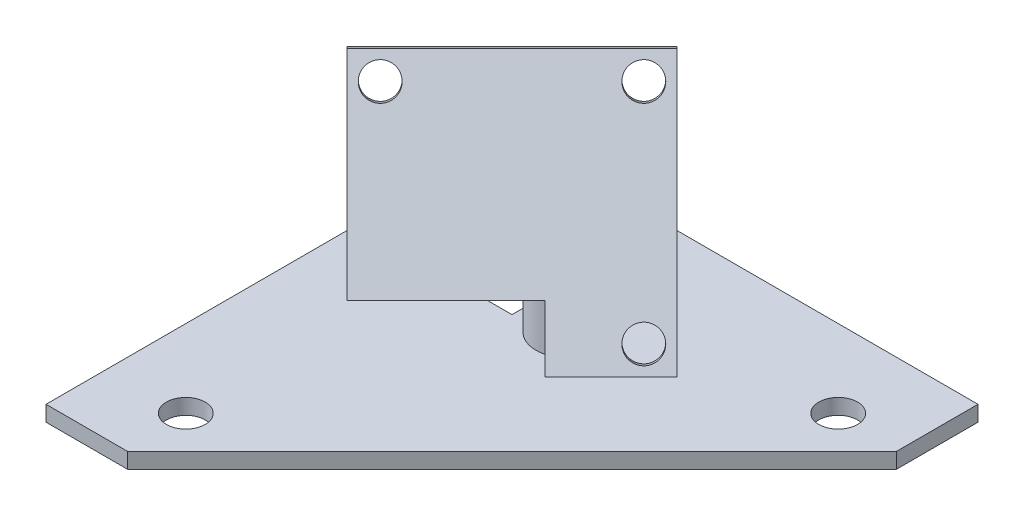
ISO-10303-21;
HEADER;
FILE_DESCRIPTION(('STEP AP214'),'2;1');
FILE_NAME('part.step','',(''),(''),'','','');
FILE_SCHEMA(('AUTOMOTIVE_DESIGN { 1 0 10303 214 1 1 1 1 }'));
ENDSEC;
DATA;
#1=APPLICATION_CONTEXT('core data for automotive mechanical design processes');
#2=APPLICATION_PROTOCOL_DEFINITION('international standard','automotive_design',2000,#1);
#3=PRODUCT_CONTEXT('',#1,'mechanical');
#4=PRODUCT('Part','Part','',(#3));
#5=PRODUCT_RELATED_PRODUCT_CATEGORY('part','',(#4));
#6=PRODUCT_DEFINITION_FORMATION('','',#4);
#7=PRODUCT_DEFINITION_CONTEXT('part definition',#1,'design');
#8=PRODUCT_DEFINITION('design','',#6,#7);
#9=PRODUCT_DEFINITION_SHAPE('','',#8);
#10=(LENGTH_UNIT() NAMED_UNIT(*) SI_UNIT(.MILLI.,.METRE.));
#11=(NAMED_UNIT(*) PLANE_ANGLE_UNIT() SI_UNIT($,.RADIAN.));
#12=(NAMED_UNIT(*) SI_UNIT($,.STERADIAN.) SOLID_ANGLE_UNIT());
#13=UNCERTAINTY_MEASURE_WITH_UNIT(LENGTH_MEASURE(1.E-05),#10,'distance_accuracy_value','');
#14=(GEOMETRIC_REPRESENTATION_CONTEXT(3) GLOBAL_UNCERTAINTY_ASSIGNED_CONTEXT((#13)) GLOBAL_UNIT_ASSIGNED_CONTEXT((#10,
#11,#12)) REPRESENTATION_CONTEXT('',''));
#15=CARTESIAN_POINT('',(0.,0.,0.));
#16=DIRECTION('',(0.,0.,1.));
#17=DIRECTION('',(1.,0.,0.));
#18=AXIS2_PLACEMENT_3D('',#15,#16,#17);
#19=CARTESIAN_POINT('',(0.,2.,0.));
#20=DIRECTION('',(0.,0.,-1.));
#21=DIRECTION('',(-1.,0.,0.));
#22=AXIS2_PLACEMENT_3D('',#19,#20,#21);
#23=PLANE('',#22);
#24=DIRECTION('',(1.,0.,0.));
#25=VECTOR('',#24,1.);
#26=CARTESIAN_POINT('',(0.,0.,0.));
#27=LINE('',#26,#25);
#28=CARTESIAN_POINT('',(20.,0.,0.));
#29=VERTEX_POINT('',#28);
#30=CARTESIAN_POINT('',(60.,0.,0.));
#31=VERTEX_POINT('',#30);
#32=EDGE_CURVE('E135',#29,#31,#27,.T.);
#33=ORIENTED_EDGE('',*,*,#32,.F.);
#34=DIRECTION('',(0.,-1.,0.));
#35=VECTOR('',#34,1.);
#36=CARTESIAN_POINT('',(20.,2.,0.));
#37=LINE('',#36,#35);
#38=CARTESIAN_POINT('',(20.,2.,0.));
#39=VERTEX_POINT('',#38);
#40=EDGE_CURVE('E11',#39,#29,#37,.T.);
#41=ORIENTED_EDGE('',*,*,#40,.F.);
#42=DIRECTION('',(1.,0.,0.));
#43=VECTOR('',#42,1.);
#44=CARTESIAN_POINT('',(0.,2.,0.));
#45=LINE('',#44,#43);
#46=CARTESIAN_POINT('',(60.,2.,0.));
#47=VERTEX_POINT('',#46);
#48=EDGE_CURVE('E173',#39,#47,#45,.T.);
#49=ORIENTED_EDGE('',*,*,#48,.T.);
#50=DIRECTION('',(0.,-1.,0.));
#51=VECTOR('',#50,1.);
#52=CARTESIAN_POINT('',(60.,2.,0.));
#53=LINE('',#52,#51);
#54=EDGE_CURVE('E52',#47,#31,#53,.T.);
#55=ORIENTED_EDGE('',*,*,#54,.T.);
#56=EDGE_LOOP('',(#33,#41,#49,#55));
#57=FACE_BOUND('',#56,.T.);
#58=ADVANCED_FACE('F35',(#57),#23,.T.);
#59=CARTESIAN_POINT('',(20.,2.,0.));
#60=DIRECTION('',(1.,0.,0.));
#61=DIRECTION('',(0.,0.,-1.));
#62=AXIS2_PLACEMENT_3D('',#59,#60,#61);
#63=PLANE('',#62);
#64=DIRECTION('',(0.,0.,1.));
#65=VECTOR('',#64,1.);
#66=CARTESIAN_POINT('',(20.,0.,0.));
#67=LINE('',#66,#65);
#68=CARTESIAN_POINT('',(20.,0.,20.));
#69=VERTEX_POINT('',#68);
#70=EDGE_CURVE('E137',#29,#69,#67,.T.);
#71=ORIENTED_EDGE('',*,*,#70,.T.);
#72=DIRECTION('',(0.,-1.,0.));
#73=VECTOR('',#72,1.);
#74=CARTESIAN_POINT('',(20.,2.,20.));
#75=LINE('',#74,#73);
#76=CARTESIAN_POINT('',(20.,2.,20.));
#77=VERTEX_POINT('',#76);
#78=EDGE_CURVE('E44',#77,#69,#75,.T.);
#79=ORIENTED_EDGE('',*,*,#78,.F.);
#80=DIRECTION('',(0.,0.,1.));
#81=VECTOR('',#80,1.);
#82=CARTESIAN_POINT('',(20.,2.,0.));
#83=LINE('',#82,#81);
#84=EDGE_CURVE('E171',#39,#77,#83,.T.);
#85=ORIENTED_EDGE('',*,*,#84,.F.);
#86=ORIENTED_EDGE('',*,*,#40,.T.);
#87=EDGE_LOOP('',(#71,#79,#85,#86));
#88=FACE_BOUND('',#87,.T.);
#89=ADVANCED_FACE('F165',(#88),#63,.F.);
#90=CARTESIAN_POINT('',(0.,2.,20.));
#91=DIRECTION('',(0.,0.,-1.));
#92=DIRECTION('',(-1.,0.,0.));
#93=AXIS2_PLACEMENT_3D('',#90,#91,#92);
#94=PLANE('',#93);
#95=DIRECTION('',(1.,0.,0.));
#96=VECTOR('',#95,1.);
#97=CARTESIAN_POINT('',(0.,0.,20.));
#98=LINE('',#97,#96);
#99=CARTESIAN_POINT('',(0.,0.,20.));
#100=VERTEX_POINT('',#99);
#101=EDGE_CURVE('E140',#100,#69,#98,.T.);
#102=ORIENTED_EDGE('',*,*,#101,.F.);
#103=DIRECTION('',(0.,-1.,0.));
#104=VECTOR('',#103,1.);
#105=CARTESIAN_POINT('',(0.,2.,20.));
#106=LINE('',#105,#104);
#107=CARTESIAN_POINT('',(0.,2.,20.));
#108=VERTEX_POINT('',#107);
#109=EDGE_CURVE('E156',#108,#100,#106,.T.);
#110=ORIENTED_EDGE('',*,*,#109,.F.);
#111=DIRECTION('',(1.,0.,0.));
#112=VECTOR('',#111,1.);
#113=CARTESIAN_POINT('',(0.,2.,20.));
#114=LINE('',#113,#112);
#115=EDGE_CURVE('E162',#108,#77,#114,.T.);
#116=ORIENTED_EDGE('',*,*,#115,.T.);
#117=ORIENTED_EDGE('',*,*,#78,.T.);
#118=EDGE_LOOP('',(#102,#110,#116,#117));
#119=FACE_BOUND('',#118,.T.);
#120=ADVANCED_FACE('F161',(#119),#94,.T.);
#121=CARTESIAN_POINT('',(0.,2.,0.));
#122=DIRECTION('',(1.,0.,0.));
#123=DIRECTION('',(0.,0.,-1.));
#124=AXIS2_PLACEMENT_3D('',#121,#122,#123);
#125=PLANE('',#124);
#126=DIRECTION('',(0.,0.,1.));
#127=VECTOR('',#126,1.);
#128=CARTESIAN_POINT('',(0.,0.,0.));
#129=LINE('',#128,#127);
#130=CARTESIAN_POINT('',(0.,0.,60.));
#131=VERTEX_POINT('',#130);
#132=EDGE_CURVE('E143',#100,#131,#129,.T.);
#133=ORIENTED_EDGE('',*,*,#132,.T.);
#134=DIRECTION('',(0.,-1.,0.));
#135=VECTOR('',#134,1.);
#136=CARTESIAN_POINT('',(0.,2.,60.));
#137=LINE('',#136,#135);
#138=CARTESIAN_POINT('',(0.,2.,60.));
#139=VERTEX_POINT('',#138);
#140=EDGE_CURVE('E120',#139,#131,#137,.T.);
#141=ORIENTED_EDGE('',*,*,#140,.F.);
#142=DIRECTION('',(0.,0.,1.));
#143=VECTOR('',#142,1.);
#144=CARTESIAN_POINT('',(0.,2.,0.));
#145=LINE('',#144,#143);
#146=EDGE_CURVE('E109',#108,#139,#145,.T.);
#147=ORIENTED_EDGE('',*,*,#146,.F.);
#148=ORIENTED_EDGE('',*,*,#109,.T.);
#149=EDGE_LOOP('',(#133,#141,#147,#148));
#150=FACE_BOUND('',#149,.T.);
#151=ADVANCED_FACE('F170',(#150),#125,.F.);
#152=CARTESIAN_POINT('',(0.,2.,60.));
#153=DIRECTION('',(0.,0.,-1.));
#154=DIRECTION('',(-1.,0.,0.));
#155=AXIS2_PLACEMENT_3D('',#152,#153,#154);
#156=PLANE('',#155);
#157=DIRECTION('',(1.,0.,0.));
#158=VECTOR('',#157,1.);
#159=CARTESIAN_POINT('',(0.,0.,60.));
#160=LINE('',#159,#158);
#161=CARTESIAN_POINT('',(10.5025253169417,0.,60.));
#162=VERTEX_POINT('',#161);
#163=EDGE_CURVE('E117',#131,#162,#160,.T.);
#164=ORIENTED_EDGE('',*,*,#163,.T.);
#165=DIRECTION('',(0.,-1.,0.));
#166=VECTOR('',#165,1.);
#167=CARTESIAN_POINT('',(10.5025253169417,2.,60.));
#168=LINE('',#167,#166);
#169=CARTESIAN_POINT('',(10.5025253169417,2.,60.));
#170=VERTEX_POINT('',#169);
#171=EDGE_CURVE('E115',#170,#162,#168,.T.);
#172=ORIENTED_EDGE('',*,*,#171,.F.);
#173=DIRECTION('',(1.,0.,0.));
#174=VECTOR('',#173,1.);
#175=CARTESIAN_POINT('',(0.,2.,60.));
#176=LINE('',#175,#174);
#177=EDGE_CURVE('E100',#139,#170,#176,.T.);
#178=ORIENTED_EDGE('',*,*,#177,.F.);
#179=ORIENTED_EDGE('',*,*,#140,.T.);
#180=EDGE_LOOP('',(#164,#172,#178,#179));
#181=FACE_BOUND('',#180,.T.);
#182=ADVANCED_FACE('F116',(#181),#156,.F.);
#183=CARTESIAN_POINT('',(35.2512626584708,2.,35.2512626584708));
#184=DIRECTION('',(0.707106781186547,0.,0.707106781186547));
#185=DIRECTION('',(0.707106781186548,0.,-0.707106781186548));
#186=AXIS2_PLACEMENT_3D('',#183,#184,#185);
#187=PLANE('',#186);
#188=DIRECTION('',(-0.707106781186548,0.,0.707106781186548));
#189=VECTOR('',#188,1.);
#190=CARTESIAN_POINT('',(35.2512626584708,0.,35.2512626584708));
#191=LINE('',#190,#189);
#192=CARTESIAN_POINT('',(60.,0.,10.5025253169417));
#193=VERTEX_POINT('',#192);
#194=EDGE_CURVE('E147',#193,#162,#191,.T.);
#195=ORIENTED_EDGE('',*,*,#194,.F.);
#196=DIRECTION('',(0.,-1.,0.));
#197=VECTOR('',#196,1.);
#198=CARTESIAN_POINT('',(60.,2.,10.5025253169417));
#199=LINE('',#198,#197);
#200=CARTESIAN_POINT('',(60.,2.,10.5025253169417));
#201=VERTEX_POINT('',#200);
#202=EDGE_CURVE('E75',#201,#193,#199,.T.);
#203=ORIENTED_EDGE('',*,*,#202,.F.);
#204=DIRECTION('',(-0.707106781186548,0.,0.707106781186548));
#205=VECTOR('',#204,1.);
#206=CARTESIAN_POINT('',(35.2512626584708,2.,35.2512626584708));
#207=LINE('',#206,#205);
#208=EDGE_CURVE('E106',#201,#170,#207,.T.);
#209=ORIENTED_EDGE('',*,*,#208,.T.);
#210=ORIENTED_EDGE('',*,*,#171,.T.);
#211=EDGE_LOOP('',(#195,#203,#209,#210));
#212=FACE_BOUND('',#211,.T.);
#213=ADVANCED_FACE('F122',(#212),#187,.T.);
#214=CARTESIAN_POINT('',(10.,2.,52.));
#215=DIRECTION('',(0.,-1.,0.));
#216=DIRECTION('',(0.,0.,-1.));
#217=AXIS2_PLACEMENT_3D('',#214,#215,#216);
#218=CYLINDRICAL_SURFACE('',#217,2.5);
#219=CARTESIAN_POINT('',(10.,2.,52.));
#220=DIRECTION('',(0.,1.,0.));
#221=DIRECTION('',(0.,0.,1.));
#222=AXIS2_PLACEMENT_3D('',#219,#220,#221);
#223=CIRCLE('',#222,2.5);
#224=CARTESIAN_POINT('',(10.,2.,54.5));
#225=VERTEX_POINT('',#224);
#226=EDGE_CURVE('E177',#225,#225,#223,.T.);
#227=ORIENTED_EDGE('',*,*,#226,.T.);
#228=EDGE_LOOP('',(#227));
#229=FACE_BOUND('',#228,.T.);
#230=CARTESIAN_POINT('',(10.,0.,52.));
#231=DIRECTION('',(0.,1.,0.));
#232=DIRECTION('',(0.,0.,1.));
#233=AXIS2_PLACEMENT_3D('',#230,#231,#232);
#234=CIRCLE('',#233,2.5);
#235=CARTESIAN_POINT('',(10.,0.,54.5));
#236=VERTEX_POINT('',#235);
#237=EDGE_CURVE('E131',#236,#236,#234,.T.);
#238=ORIENTED_EDGE('',*,*,#237,.F.);
#239=EDGE_LOOP('',(#238));
#240=FACE_BOUND('',#239,.T.);
#241=ADVANCED_FACE('F295',(#229,#240),#218,.F.);
#242=CARTESIAN_POINT('',(52.,2.,10.));
#243=DIRECTION('',(0.,-1.,0.));
#244=DIRECTION('',(0.,0.,-1.));
#245=AXIS2_PLACEMENT_3D('',#242,#243,#244);
#246=CYLINDRICAL_SURFACE('',#245,2.5);
#247=CARTESIAN_POINT('',(52.,2.,10.));
#248=DIRECTION('',(0.,1.,0.));
#249=DIRECTION('',(0.,0.,1.));
#250=AXIS2_PLACEMENT_3D('',#247,#248,#249);
#251=CIRCLE('',#250,2.5);
#252=CARTESIAN_POINT('',(52.,2.,12.5));
#253=VERTEX_POINT('',#252);
#254=EDGE_CURVE('E152',#253,#253,#251,.T.);
#255=ORIENTED_EDGE('',*,*,#254,.T.);
#256=EDGE_LOOP('',(#255));
#257=FACE_BOUND('',#256,.T.);
#258=CARTESIAN_POINT('',(52.,0.,10.));
#259=DIRECTION('',(0.,1.,0.));
#260=DIRECTION('',(0.,0.,1.));
#261=AXIS2_PLACEMENT_3D('',#258,#259,#260);
#262=CIRCLE('',#261,2.5);
#263=CARTESIAN_POINT('',(52.,0.,12.5));
#264=VERTEX_POINT('',#263);
#265=EDGE_CURVE('E128',#264,#264,#262,.T.);
#266=ORIENTED_EDGE('',*,*,#265,.F.);
#267=EDGE_LOOP('',(#266));
#268=FACE_BOUND('',#267,.T.);
#269=ADVANCED_FACE('F37',(#257,#268),#246,.F.);
#270=CARTESIAN_POINT('',(60.,2.,0.));
#271=DIRECTION('',(1.,0.,0.));
#272=DIRECTION('',(0.,0.,-1.));
#273=AXIS2_PLACEMENT_3D('',#270,#271,#272);
#274=PLANE('',#273);
#275=DIRECTION('',(0.,0.,1.));
#276=VECTOR('',#275,1.);
#277=CARTESIAN_POINT('',(60.,0.,0.));
#278=LINE('',#277,#276);
#279=EDGE_CURVE('E149',#31,#193,#278,.T.);
#280=ORIENTED_EDGE('',*,*,#279,.F.);
#281=ORIENTED_EDGE('',*,*,#54,.F.);
#282=DIRECTION('',(0.,0.,1.));
#283=VECTOR('',#282,1.);
#284=CARTESIAN_POINT('',(60.,2.,0.));
#285=LINE('',#284,#283);
#286=EDGE_CURVE('E123',#47,#201,#285,.T.);
#287=ORIENTED_EDGE('',*,*,#286,.T.);
#288=ORIENTED_EDGE('',*,*,#202,.T.);
#289=EDGE_LOOP('',(#280,#281,#287,#288));
#290=FACE_BOUND('',#289,.T.);
#291=ADVANCED_FACE('F302',(#290),#274,.T.);
#292=CARTESIAN_POINT('',(0.,2.,0.));
#293=DIRECTION('',(0.,1.,0.));
#294=DIRECTION('',(0.,0.,1.));
#295=AXIS2_PLACEMENT_3D('',#292,#293,#294);
#296=PLANE('',#295);
#297=CARTESIAN_POINT('',(25.5115964232404,2.,18.4405286113749));
#298=DIRECTION('',(0.,1.,0.));
#299=DIRECTION('',(0.,0.,1.));
#300=AXIS2_PLACEMENT_3D('',#297,#298,#299);
#301=CIRCLE('',#300,4.);
#302=CARTESIAN_POINT('',(25.5115964232404,2.,22.4405286113749));
#303=VERTEX_POINT('',#302);
#304=EDGE_CURVE('E184',#303,#303,#301,.T.);
#305=ORIENTED_EDGE('',*,*,#304,.F.);
#306=EDGE_LOOP('',(#305));
#307=FACE_BOUND('',#306,.T.);
#308=ORIENTED_EDGE('',*,*,#254,.F.);
#309=EDGE_LOOP('',(#308));
#310=FACE_BOUND('',#309,.T.);
#311=ORIENTED_EDGE('',*,*,#226,.F.);
#312=EDGE_LOOP('',(#311));
#313=FACE_BOUND('',#312,.T.);
#314=ORIENTED_EDGE('',*,*,#48,.F.);
#315=ORIENTED_EDGE('',*,*,#84,.T.);
#316=ORIENTED_EDGE('',*,*,#115,.F.);
#317=ORIENTED_EDGE('',*,*,#146,.T.);
#318=ORIENTED_EDGE('',*,*,#177,.T.);
#319=ORIENTED_EDGE('',*,*,#208,.F.);
#320=ORIENTED_EDGE('',*,*,#286,.F.);
#321=EDGE_LOOP('',(#314,#315,#316,#317,#318,#319,#320));
#322=FACE_BOUND('',#321,.T.);
#323=ADVANCED_FACE('F103',(#307,#310,#313,#322),#296,.T.);
#324=CARTESIAN_POINT('',(0.,0.,0.));
#325=DIRECTION('',(0.,1.,0.));
#326=DIRECTION('',(0.,0.,1.));
#327=AXIS2_PLACEMENT_3D('',#324,#325,#326);
#328=PLANE('',#327);
#329=ORIENTED_EDGE('',*,*,#265,.T.);
#330=EDGE_LOOP('',(#329));
#331=FACE_BOUND('',#330,.T.);
#332=ORIENTED_EDGE('',*,*,#237,.T.);
#333=EDGE_LOOP('',(#332));
#334=FACE_BOUND('',#333,.T.);
#335=ORIENTED_EDGE('',*,*,#32,.T.);
#336=ORIENTED_EDGE('',*,*,#279,.T.);
#337=ORIENTED_EDGE('',*,*,#194,.T.);
#338=ORIENTED_EDGE('',*,*,#163,.F.);
#339=ORIENTED_EDGE('',*,*,#132,.F.);
#340=ORIENTED_EDGE('',*,*,#101,.T.);
#341=ORIENTED_EDGE('',*,*,#70,.F.);
#342=EDGE_LOOP('',(#335,#336,#337,#338,#339,#340,#341));
#343=FACE_BOUND('',#342,.T.);
#344=ADVANCED_FACE('F168',(#331,#334,#343),#328,.F.);
#345=CARTESIAN_POINT('',(25.5115964232404,38.6251153090657,18.4405286113749));
#346=DIRECTION('',(0.,-1.,0.));
#347=DIRECTION('',(0.,0.,-1.));
#348=AXIS2_PLACEMENT_3D('',#345,#346,#347);
#349=CYLINDRICAL_SURFACE('',#348,4.);
#350=ORIENTED_EDGE('',*,*,#304,.T.);
#351=EDGE_LOOP('',(#350));
#352=FACE_BOUND('',#351,.T.);
#353=CARTESIAN_POINT('',(25.5115964232404,21.6545525605885,18.4405286113749));
#354=DIRECTION('',(0.612372435695795,0.499999999999998,0.612372435695795));
#355=DIRECTION('',(0.353553390593273,-0.86602540378444,0.353553390593272));
#356=AXIS2_PLACEMENT_3D('',#353,#354,#355);
#357=ELLIPSE('',#356,8.00000000000004,4.);
#358=CARTESIAN_POINT('',(28.3400235479866,14.726349330313,21.2689557361211));
#359=VERTEX_POINT('',#358);
#360=EDGE_CURVE('E132',#359,#359,#357,.T.);
#361=ORIENTED_EDGE('',*,*,#360,.F.);
#362=EDGE_LOOP('',(#361));
#363=FACE_BOUND('',#362,.T.);
#364=ADVANCED_FACE('F310',(#352,#363),#349,.T.);
#365=CARTESIAN_POINT('',(26.4584376506471,19.8711730708738,22.2157969635278));
#366=DIRECTION('',(-0.707106781186547,0.,0.707106781186548));
#367=DIRECTION('',(0.707106781186548,0.,0.707106781186547));
#368=AXIS2_PLACEMENT_3D('',#365,#366,#367);
#369=PLANE('',#368);
#370=DIRECTION('',(-0.353553390593272,0.86602540378444,-0.353553390593272));
#371=VECTOR('',#370,1.);
#372=CARTESIAN_POINT('',(25.2336927792555,18.8711730708738,20.9910520921362));
#373=LINE('',#372,#371);
#374=CARTESIAN_POINT('',(31.1684506727327,4.33404448489977,26.9258099856134));
#375=VERTEX_POINT('',#374);
#376=CARTESIAN_POINT('',(28.6935769385798,10.3962223113909,24.4509362514605));
#377=VERTEX_POINT('',#376);
#378=EDGE_CURVE('E228',#375,#377,#373,.T.);
#379=ORIENTED_EDGE('',*,*,#378,.F.);
#380=DIRECTION('',(-0.612372435695795,-0.499999999999998,-0.612372435695795));
#381=VECTOR('',#380,1.);
#382=CARTESIAN_POINT('',(32.3931955441243,5.33404448489977,28.150554857005));
#383=LINE('',#382,#381);
#384=CARTESIAN_POINT('',(32.3931955441243,5.33404448489977,28.150554857005));
#385=VERTEX_POINT('',#384);
#386=EDGE_CURVE('E187',#385,#375,#383,.T.);
#387=ORIENTED_EDGE('',*,*,#386,.F.);
#388=DIRECTION('',(-0.353553390593272,0.86602540378444,-0.353553390593272));
#389=VECTOR('',#388,1.);
#390=CARTESIAN_POINT('',(26.4584376506471,19.8711730708738,22.2157969635278));
#391=LINE('',#390,#389);
#392=CARTESIAN_POINT('',(29.9183218099714,11.3962223113909,25.6756811228521));
#393=VERTEX_POINT('',#392);
#394=EDGE_CURVE('E254',#385,#393,#391,.T.);
#395=ORIENTED_EDGE('',*,*,#394,.T.);
#396=DIRECTION('',(-0.612372435695795,-0.499999999999998,-0.612372435695795));
#397=VECTOR('',#396,1.);
#398=CARTESIAN_POINT('',(29.9183218099714,11.3962223113909,25.6756811228521));
#399=LINE('',#398,#397);
#400=EDGE_CURVE('E202',#393,#377,#399,.T.);
#401=ORIENTED_EDGE('',*,*,#400,.T.);
#402=EDGE_LOOP('',(#379,#387,#395,#401));
#403=FACE_BOUND('',#402,.T.);
#404=ADVANCED_FACE('F317',(#403),#369,.T.);
#405=CARTESIAN_POINT('',(30.2718752005647,5.33404448489977,30.2718752005647));
#406=DIRECTION('',(0.353553390593272,-0.86602540378444,0.353553390593273));
#407=DIRECTION('',(0.,-0.377964473009226,-0.925820099772552));
#408=AXIS2_PLACEMENT_3D('',#405,#406,#407);
#409=PLANE('',#408);
#410=DIRECTION('',(-0.707106781186548,0.,0.707106781186548));
#411=VECTOR('',#410,1.);
#412=CARTESIAN_POINT('',(29.0471303291731,4.33404448489977,29.0471303291731));
#413=LINE('',#412,#411);
#414=CARTESIAN_POINT('',(39.6537320469713,4.33404448489977,18.4405286113749));
#415=VERTEX_POINT('',#414);
#416=EDGE_CURVE('E225',#415,#375,#413,.T.);
#417=ORIENTED_EDGE('',*,*,#416,.F.);
#418=DIRECTION('',(-0.612372435695795,-0.499999999999998,-0.612372435695795));
#419=VECTOR('',#418,1.);
#420=CARTESIAN_POINT('',(40.8784769183629,5.33404448489976,19.6652734827664));
#421=LINE('',#420,#419);
#422=CARTESIAN_POINT('',(40.8784769183629,5.33404448489976,19.6652734827664));
#423=VERTEX_POINT('',#422);
#424=EDGE_CURVE('E190',#423,#415,#421,.T.);
#425=ORIENTED_EDGE('',*,*,#424,.F.);
#426=DIRECTION('',(-0.707106781186548,0.,0.707106781186548));
#427=VECTOR('',#426,1.);
#428=CARTESIAN_POINT('',(30.2718752005647,5.33404448489977,30.2718752005647));
#429=LINE('',#428,#427);
#430=EDGE_CURVE('E251',#423,#385,#429,.T.);
#431=ORIENTED_EDGE('',*,*,#430,.T.);
#432=ORIENTED_EDGE('',*,*,#386,.T.);
#433=EDGE_LOOP('',(#417,#425,#431,#432));
#434=FACE_BOUND('',#433,.T.);
#435=ADVANCED_FACE('F387',(#434),#409,.T.);
#436=CARTESIAN_POINT('',(34.9437190248857,19.8711730708738,13.7305155892892));
#437=DIRECTION('',(-0.707106781186547,0.,0.707106781186548));
#438=DIRECTION('',(0.707106781186548,0.,0.707106781186547));
#439=AXIS2_PLACEMENT_3D('',#436,#437,#438);
#440=PLANE('',#439);
#441=DIRECTION('',(-0.353553390593273,0.86602540378444,-0.353553390593272));
#442=VECTOR('',#441,1.);
#443=CARTESIAN_POINT('',(33.7189741534941,18.8711730708738,12.5057707178976));
#444=LINE('',#443,#442);
#445=CARTESIAN_POINT('',(29.0471303291731,30.314806598433,7.83392689357668));
#446=VERTEX_POINT('',#445);
#447=EDGE_CURVE('E222',#415,#446,#444,.T.);
#448=ORIENTED_EDGE('',*,*,#447,.T.);
#449=DIRECTION('',(-0.612372435695795,-0.499999999999998,-0.612372435695795));
#450=VECTOR('',#449,1.);
#451=CARTESIAN_POINT('',(30.2718752005647,31.314806598433,9.05867176496827));
#452=LINE('',#451,#450);
#453=CARTESIAN_POINT('',(30.2718752005647,31.314806598433,9.05867176496827));
#454=VERTEX_POINT('',#453);
#455=EDGE_CURVE('E193',#454,#446,#452,.T.);
#456=ORIENTED_EDGE('',*,*,#455,.F.);
#457=DIRECTION('',(-0.353553390593273,0.86602540378444,-0.353553390593272));
#458=VECTOR('',#457,1.);
#459=CARTESIAN_POINT('',(34.9437190248857,19.8711730708738,13.7305155892892));
#460=LINE('',#459,#458);
#461=EDGE_CURVE('E248',#423,#454,#460,.T.);
#462=ORIENTED_EDGE('',*,*,#461,.F.);
#463=ORIENTED_EDGE('',*,*,#424,.T.);
#464=EDGE_LOOP('',(#448,#456,#462,#463));
#465=FACE_BOUND('',#464,.T.);
#466=ADVANCED_FACE('F397',(#465),#440,.F.);
#467=CARTESIAN_POINT('',(19.6652734827665,31.314806598433,19.6652734827665));
#468=DIRECTION('',(0.353553390593272,-0.86602540378444,0.353553390593272));
#469=DIRECTION('',(0.925820099772552,0.377964473009226,0.));
#470=AXIS2_PLACEMENT_3D('',#467,#468,#469);
#471=PLANE('',#470);
#472=DIRECTION('',(-0.707106781186547,0.,0.707106781186548));
#473=VECTOR('',#472,1.);
#474=CARTESIAN_POINT('',(18.4405286113749,30.314806598433,18.4405286113749));
#475=LINE('',#474,#473);
#476=CARTESIAN_POINT('',(7.83392689357669,30.314806598433,29.0471303291731));
#477=VERTEX_POINT('',#476);
#478=EDGE_CURVE('E219',#446,#477,#475,.T.);
#479=ORIENTED_EDGE('',*,*,#478,.T.);
#480=DIRECTION('',(-0.612372435695795,-0.499999999999998,-0.612372435695795));
#481=VECTOR('',#480,1.);
#482=CARTESIAN_POINT('',(9.05867176496828,31.314806598433,30.2718752005647));
#483=LINE('',#482,#481);
#484=CARTESIAN_POINT('',(9.05867176496828,31.314806598433,30.2718752005647));
#485=VERTEX_POINT('',#484);
#486=EDGE_CURVE('E196',#485,#477,#483,.T.);
#487=ORIENTED_EDGE('',*,*,#486,.F.);
#488=DIRECTION('',(-0.707106781186547,0.,0.707106781186548));
#489=VECTOR('',#488,1.);
#490=CARTESIAN_POINT('',(19.6652734827665,31.314806598433,19.6652734827665));
#491=LINE('',#490,#489);
#492=EDGE_CURVE('E245',#454,#485,#491,.T.);
#493=ORIENTED_EDGE('',*,*,#492,.F.);
#494=ORIENTED_EDGE('',*,*,#455,.T.);
#495=EDGE_LOOP('',(#479,#487,#493,#494));
#496=FACE_BOUND('',#495,.T.);
#497=ADVANCED_FACE('F407',(#496),#471,.F.);
#498=CARTESIAN_POINT('',(13.7305155892892,19.8711730708738,34.9437190248857));
#499=DIRECTION('',(-0.707106781186547,0.,0.707106781186548));
#500=DIRECTION('',(0.707106781186548,0.,0.707106781186547));
#501=AXIS2_PLACEMENT_3D('',#498,#499,#500);
#502=PLANE('',#501);
#503=DIRECTION('',(-0.353553390593273,0.86602540378444,-0.353553390593272));
#504=VECTOR('',#503,1.);
#505=CARTESIAN_POINT('',(12.5057707178976,18.8711730708738,33.7189741534941));
#506=LINE('',#505,#504);
#507=CARTESIAN_POINT('',(15.965654877222,10.3962223113909,37.1788583128184));
#508=VERTEX_POINT('',#507);
#509=EDGE_CURVE('E216',#508,#477,#506,.T.);
#510=ORIENTED_EDGE('',*,*,#509,.F.);
#511=DIRECTION('',(-0.612372435695795,-0.499999999999998,-0.612372435695795));
#512=VECTOR('',#511,1.);
#513=CARTESIAN_POINT('',(17.1903997486135,11.3962223113908,38.40360318421));
#514=LINE('',#513,#512);
#515=CARTESIAN_POINT('',(17.1903997486135,11.3962223113908,38.40360318421));
#516=VERTEX_POINT('',#515);
#517=EDGE_CURVE('E199',#516,#508,#514,.T.);
#518=ORIENTED_EDGE('',*,*,#517,.F.);
#519=DIRECTION('',(-0.353553390593273,0.86602540378444,-0.353553390593272));
#520=VECTOR('',#519,1.);
#521=CARTESIAN_POINT('',(13.7305155892892,19.8711730708738,34.9437190248857));
#522=LINE('',#521,#520);
#523=EDGE_CURVE('E242',#516,#485,#522,.T.);
#524=ORIENTED_EDGE('',*,*,#523,.T.);
#525=ORIENTED_EDGE('',*,*,#486,.T.);
#526=EDGE_LOOP('',(#510,#518,#524,#525));
#527=FACE_BOUND('',#526,.T.);
#528=ADVANCED_FACE('F417',(#527),#502,.T.);
#529=CARTESIAN_POINT('',(12.2406522803077,28.7167303870796,29.2112150287849));
#530=DIRECTION('',(-0.612372435695795,-0.499999999999998,-0.612372435695795));
#531=DIRECTION('',(-0.707106781186547,0.,0.707106781186548));
#532=AXIS2_PLACEMENT_3D('',#529,#530,#531);
#533=CYLINDRICAL_SURFACE('',#532,2.);
#534=CARTESIAN_POINT('',(12.2406522803077,28.7167303870796,29.2112150287849));
#535=DIRECTION('',(0.612372435695795,0.499999999999998,0.612372435695795));
#536=DIRECTION('',(0.707106781186547,0.,-0.707106781186548));
#537=AXIS2_PLACEMENT_3D('',#534,#535,#536);
#538=CIRCLE('',#537,2.);
#539=CARTESIAN_POINT('',(13.6548658426808,28.7167303870796,27.7970014664118));
#540=VERTEX_POINT('',#539);
#541=EDGE_CURVE('E236',#540,#540,#538,.T.);
#542=ORIENTED_EDGE('',*,*,#541,.T.);
#543=EDGE_LOOP('',(#542));
#544=FACE_BOUND('',#543,.T.);
#545=CARTESIAN_POINT('',(11.0159074089161,27.7167303870796,27.9864701573933));
#546=DIRECTION('',(0.612372435695795,0.499999999999998,0.612372435695795));
#547=DIRECTION('',(0.707106781186547,0.,-0.707106781186548));
#548=AXIS2_PLACEMENT_3D('',#545,#546,#547);
#549=CIRCLE('',#548,2.);
#550=CARTESIAN_POINT('',(12.4301209712892,27.7167303870796,26.5722565950202));
#551=VERTEX_POINT('',#550);
#552=EDGE_CURVE('E210',#551,#551,#549,.T.);
#553=ORIENTED_EDGE('',*,*,#552,.F.);
#554=EDGE_LOOP('',(#553));
#555=FACE_BOUND('',#554,.T.);
#556=ADVANCED_FACE('F427',(#544,#555),#533,.F.);
#557=CARTESIAN_POINT('',(27.7970014664118,11.3962223113909,27.7970014664118));
#558=DIRECTION('',(-0.353553390593273,0.86602540378444,-0.353553390593272));
#559=DIRECTION('',(-0.925820099772552,-0.377964473009226,0.));
#560=AXIS2_PLACEMENT_3D('',#557,#558,#559);
#561=PLANE('',#560);
#562=DIRECTION('',(0.707106781186547,0.,-0.707106781186548));
#563=VECTOR('',#562,1.);
#564=CARTESIAN_POINT('',(26.5722565950202,10.3962223113909,26.5722565950202));
#565=LINE('',#564,#563);
#566=EDGE_CURVE('E213',#508,#377,#565,.T.);
#567=ORIENTED_EDGE('',*,*,#566,.T.);
#568=ORIENTED_EDGE('',*,*,#400,.F.);
#569=DIRECTION('',(0.707106781186547,0.,-0.707106781186548));
#570=VECTOR('',#569,1.);
#571=CARTESIAN_POINT('',(27.7970014664118,11.3962223113909,27.7970014664118));
#572=LINE('',#571,#570);
#573=EDGE_CURVE('E239',#516,#393,#572,.T.);
#574=ORIENTED_EDGE('',*,*,#573,.F.);
#575=ORIENTED_EDGE('',*,*,#517,.T.);
#576=EDGE_LOOP('',(#567,#568,#574,#575));
#577=FACE_BOUND('',#576,.T.);
#578=ADVANCED_FACE('F437',(#577),#561,.F.);
#579=CARTESIAN_POINT('',(37.6964964030234,7.93212069625309,20.7259336545463));
#580=DIRECTION('',(-0.612372435695795,-0.499999999999998,-0.612372435695795));
#581=DIRECTION('',(-0.707106781186547,0.,0.707106781186548));
#582=AXIS2_PLACEMENT_3D('',#579,#580,#581);
#583=CYLINDRICAL_SURFACE('',#582,2.);
#584=CARTESIAN_POINT('',(37.6964964030234,7.93212069625309,20.7259336545463));
#585=DIRECTION('',(0.612372435695795,0.499999999999998,0.612372435695795));
#586=DIRECTION('',(0.707106781186547,0.,-0.707106781186548));
#587=AXIS2_PLACEMENT_3D('',#584,#585,#586);
#588=CIRCLE('',#587,2.);
#589=CARTESIAN_POINT('',(39.1107099653965,7.93212069625309,19.3117200921732));
#590=VERTEX_POINT('',#589);
#591=EDGE_CURVE('E209',#590,#590,#588,.T.);
#592=ORIENTED_EDGE('',*,*,#591,.T.);
#593=EDGE_LOOP('',(#592));
#594=FACE_BOUND('',#593,.T.);
#595=CARTESIAN_POINT('',(36.4717515316318,6.9321206962531,19.5011887831547));
#596=DIRECTION('',(0.612372435695795,0.499999999999998,0.612372435695795));
#597=DIRECTION('',(0.707106781186547,0.,-0.707106781186548));
#598=AXIS2_PLACEMENT_3D('',#595,#596,#597);
#599=CIRCLE('',#598,2.);
#600=CARTESIAN_POINT('',(37.8859650940049,6.9321206962531,18.0869752207816));
#601=VERTEX_POINT('',#600);
#602=EDGE_CURVE('E231',#601,#601,#599,.T.);
#603=ORIENTED_EDGE('',*,*,#602,.F.);
#604=EDGE_LOOP('',(#603));
#605=FACE_BOUND('',#604,.T.);
#606=ADVANCED_FACE('F260',(#594,#605),#583,.F.);
#607=CARTESIAN_POINT('',(29.2112150287849,28.7167303870796,12.2406522803077));
#608=DIRECTION('',(-0.612372435695795,-0.499999999999998,-0.612372435695795));
#609=DIRECTION('',(-0.707106781186547,0.,0.707106781186548));
#610=AXIS2_PLACEMENT_3D('',#607,#608,#609);
#611=CYLINDRICAL_SURFACE('',#610,2.);
#612=CARTESIAN_POINT('',(29.2112150287849,28.7167303870796,12.2406522803077));
#613=DIRECTION('',(0.612372435695795,0.499999999999998,0.612372435695795));
#614=DIRECTION('',(0.707106781186547,0.,-0.707106781186548));
#615=AXIS2_PLACEMENT_3D('',#612,#613,#614);
#616=CIRCLE('',#615,2.);
#617=CARTESIAN_POINT('',(30.625428591158,28.7167303870796,10.8264387179346));
#618=VERTEX_POINT('',#617);
#619=EDGE_CURVE('E205',#618,#618,#616,.F.);
#620=ORIENTED_EDGE('',*,*,#619,.F.);
#621=EDGE_LOOP('',(#620));
#622=FACE_BOUND('',#621,.T.);
#623=CARTESIAN_POINT('',(27.9864701573933,27.7167303870796,11.0159074089161));
#624=DIRECTION('',(0.612372435695795,0.499999999999998,0.612372435695795));
#625=DIRECTION('',(0.707106781186547,0.,-0.707106781186548));
#626=AXIS2_PLACEMENT_3D('',#623,#624,#625);
#627=CIRCLE('',#626,2.);
#628=CARTESIAN_POINT('',(29.4006837197664,27.7167303870796,9.60169384654304));
#629=VERTEX_POINT('',#628);
#630=EDGE_CURVE('E206',#629,#629,#627,.F.);
#631=ORIENTED_EDGE('',*,*,#630,.T.);
#632=EDGE_LOOP('',(#631));
#633=FACE_BOUND('',#632,.T.);
#634=ADVANCED_FACE('F267',(#622,#633),#611,.F.);
#635=CARTESIAN_POINT('',(24.3371173070874,19.8711730708738,24.3371173070874));
#636=DIRECTION('',(0.612372435695795,0.499999999999998,0.612372435695795));
#637=DIRECTION('',(0.707106781186547,0.,-0.707106781186548));
#638=AXIS2_PLACEMENT_3D('',#635,#636,#637);
#639=PLANE('',#638);
#640=ORIENTED_EDGE('',*,*,#591,.F.);
#641=EDGE_LOOP('',(#640));
#642=FACE_BOUND('',#641,.T.);
#643=ORIENTED_EDGE('',*,*,#394,.F.);
#644=ORIENTED_EDGE('',*,*,#430,.F.);
#645=ORIENTED_EDGE('',*,*,#461,.T.);
#646=ORIENTED_EDGE('',*,*,#492,.T.);
#647=ORIENTED_EDGE('',*,*,#523,.F.);
#648=ORIENTED_EDGE('',*,*,#573,.T.);
#649=EDGE_LOOP('',(#643,#644,#645,#646,#647,#648));
#650=FACE_BOUND('',#649,.T.);
#651=ORIENTED_EDGE('',*,*,#541,.F.);
#652=EDGE_LOOP('',(#651));
#653=FACE_BOUND('',#652,.T.);
#654=ORIENTED_EDGE('',*,*,#619,.T.);
#655=EDGE_LOOP('',(#654));
#656=FACE_BOUND('',#655,.T.);
#657=ADVANCED_FACE('F263',(#642,#650,#653,#656),#639,.T.);
#658=CARTESIAN_POINT('',(23.1123724356959,18.8711730708738,23.1123724356959));
#659=DIRECTION('',(0.612372435695795,0.499999999999998,0.612372435695795));
#660=DIRECTION('',(0.707106781186547,0.,-0.707106781186548));
#661=AXIS2_PLACEMENT_3D('',#658,#659,#660);
#662=PLANE('',#661);
#663=ORIENTED_EDGE('',*,*,#360,.T.);
#664=EDGE_LOOP('',(#663));
#665=FACE_BOUND('',#664,.T.);
#666=ORIENTED_EDGE('',*,*,#602,.T.);
#667=EDGE_LOOP('',(#666));
#668=FACE_BOUND('',#667,.T.);
#669=ORIENTED_EDGE('',*,*,#378,.T.);
#670=ORIENTED_EDGE('',*,*,#566,.F.);
#671=ORIENTED_EDGE('',*,*,#509,.T.);
#672=ORIENTED_EDGE('',*,*,#478,.F.);
#673=ORIENTED_EDGE('',*,*,#447,.F.);
#674=ORIENTED_EDGE('',*,*,#416,.T.);
#675=EDGE_LOOP('',(#669,#670,#671,#672,#673,#674));
#676=FACE_BOUND('',#675,.T.);
#677=ORIENTED_EDGE('',*,*,#552,.T.);
#678=EDGE_LOOP('',(#677));
#679=FACE_BOUND('',#678,.T.);
#680=ORIENTED_EDGE('',*,*,#630,.F.);
#681=EDGE_LOOP('',(#680));
#682=FACE_BOUND('',#681,.T.);
#683=ADVANCED_FACE('F266',(#665,#668,#676,#679,#682),#662,.F.);
#684=CLOSED_SHELL('',(#58,#89,#120,#151,#182,#213,#241,#269,#291,#323,#344,#364,#404,#435,#466,
#497,#528,#556,#578,#606,#634,#657,#683));
#685=MANIFOLD_SOLID_BREP('B2',#684);
#686=ADVANCED_BREP_SHAPE_REPRESENTATION('',(#18,#685),#14);
#687=SHAPE_DEFINITION_REPRESENTATION(#9,#686);
ENDSEC;
END-ISO-10303-21;
